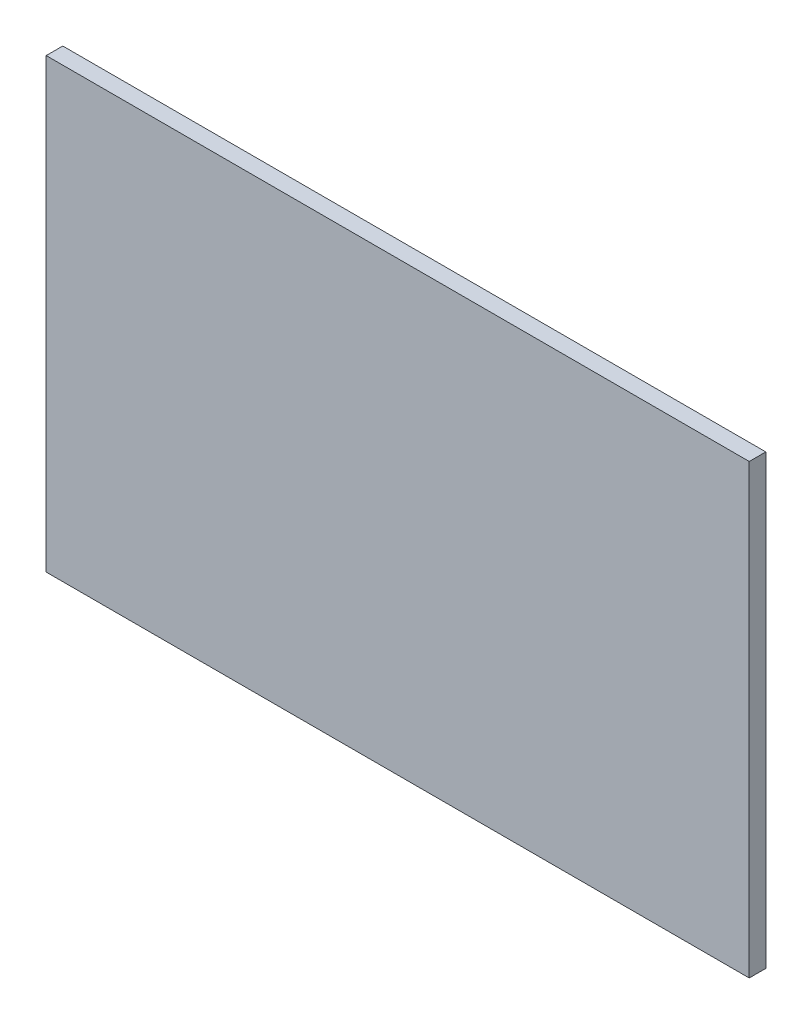
ISO-10303-21;
HEADER;
FILE_DESCRIPTION(('STEP AP214'),'2;1');
FILE_NAME('part.step','',(''),(''),'','','');
FILE_SCHEMA(('AUTOMOTIVE_DESIGN { 1 0 10303 214 1 1 1 1 }'));
ENDSEC;
DATA;
#1=APPLICATION_CONTEXT('core data for automotive mechanical design processes');
#2=APPLICATION_PROTOCOL_DEFINITION('international standard','automotive_design',2000,#1);
#3=PRODUCT_CONTEXT('',#1,'mechanical');
#4=PRODUCT('Part','Part','',(#3));
#5=PRODUCT_RELATED_PRODUCT_CATEGORY('part','',(#4));
#6=PRODUCT_DEFINITION_FORMATION('','',#4);
#7=PRODUCT_DEFINITION_CONTEXT('part definition',#1,'design');
#8=PRODUCT_DEFINITION('design','',#6,#7);
#9=PRODUCT_DEFINITION_SHAPE('','',#8);
#10=(LENGTH_UNIT() NAMED_UNIT(*) SI_UNIT(.MILLI.,.METRE.));
#11=(NAMED_UNIT(*) PLANE_ANGLE_UNIT() SI_UNIT($,.RADIAN.));
#12=(NAMED_UNIT(*) SI_UNIT($,.STERADIAN.) SOLID_ANGLE_UNIT());
#13=UNCERTAINTY_MEASURE_WITH_UNIT(LENGTH_MEASURE(1.E-05),#10,'distance_accuracy_value','');
#14=(GEOMETRIC_REPRESENTATION_CONTEXT(3) GLOBAL_UNCERTAINTY_ASSIGNED_CONTEXT((#13)) GLOBAL_UNIT_ASSIGNED_CONTEXT((#10,
#11,#12)) REPRESENTATION_CONTEXT('',''));
#15=CARTESIAN_POINT('',(0.,0.,0.));
#16=DIRECTION('',(0.,0.,1.));
#17=DIRECTION('',(1.,0.,0.));
#18=AXIS2_PLACEMENT_3D('',#15,#16,#17);
#19=CARTESIAN_POINT('',(0.,0.,1.5));
#20=DIRECTION('',(1.,0.,0.));
#21=DIRECTION('',(0.,0.,-1.));
#22=AXIS2_PLACEMENT_3D('',#19,#20,#21);
#23=PLANE('',#22);
#24=DIRECTION('',(0.,-1.,0.));
#25=VECTOR('',#24,1.);
#26=CARTESIAN_POINT('',(0.,0.,0.));
#27=LINE('',#26,#25);
#28=CARTESIAN_POINT('',(0.,40.5,0.));
#29=VERTEX_POINT('',#28);
#30=CARTESIAN_POINT('',(0.,0.,0.));
#31=VERTEX_POINT('',#30);
#32=EDGE_CURVE('E99',#29,#31,#27,.T.);
#33=ORIENTED_EDGE('',*,*,#32,.T.);
#34=DIRECTION('',(0.,0.,-1.));
#35=VECTOR('',#34,1.);
#36=CARTESIAN_POINT('',(0.,0.,1.5));
#37=LINE('',#36,#35);
#38=CARTESIAN_POINT('',(0.,0.,1.5));
#39=VERTEX_POINT('',#38);
#40=EDGE_CURVE('E11',#39,#31,#37,.T.);
#41=ORIENTED_EDGE('',*,*,#40,.F.);
#42=DIRECTION('',(0.,-1.,0.));
#43=VECTOR('',#42,1.);
#44=CARTESIAN_POINT('',(0.,0.,1.5));
#45=LINE('',#44,#43);
#46=CARTESIAN_POINT('',(0.,40.5,1.5));
#47=VERTEX_POINT('',#46);
#48=EDGE_CURVE('E87',#47,#39,#45,.T.);
#49=ORIENTED_EDGE('',*,*,#48,.F.);
#50=DIRECTION('',(0.,0.,-1.));
#51=VECTOR('',#50,1.);
#52=CARTESIAN_POINT('',(0.,40.5,1.5));
#53=LINE('',#52,#51);
#54=EDGE_CURVE('E95',#47,#29,#53,.T.);
#55=ORIENTED_EDGE('',*,*,#54,.T.);
#56=EDGE_LOOP('',(#33,#41,#49,#55));
#57=FACE_BOUND('',#56,.T.);
#58=ADVANCED_FACE('F36',(#57),#23,.F.);
#59=CARTESIAN_POINT('',(0.,0.,1.5));
#60=DIRECTION('',(0.,1.,0.));
#61=DIRECTION('',(0.,0.,1.));
#62=AXIS2_PLACEMENT_3D('',#59,#60,#61);
#63=PLANE('',#62);
#64=DIRECTION('',(1.,0.,0.));
#65=VECTOR('',#64,1.);
#66=CARTESIAN_POINT('',(0.,0.,0.));
#67=LINE('',#66,#65);
#68=CARTESIAN_POINT('',(63.65,0.,0.));
#69=VERTEX_POINT('',#68);
#70=EDGE_CURVE('E91',#31,#69,#67,.T.);
#71=ORIENTED_EDGE('',*,*,#70,.T.);
#72=DIRECTION('',(0.,0.,-1.));
#73=VECTOR('',#72,1.);
#74=CARTESIAN_POINT('',(63.65,0.,1.5));
#75=LINE('',#74,#73);
#76=CARTESIAN_POINT('',(63.65,0.,1.5));
#77=VERTEX_POINT('',#76);
#78=EDGE_CURVE('E44',#77,#69,#75,.T.);
#79=ORIENTED_EDGE('',*,*,#78,.F.);
#80=DIRECTION('',(1.,0.,0.));
#81=VECTOR('',#80,1.);
#82=CARTESIAN_POINT('',(0.,0.,1.5));
#83=LINE('',#82,#81);
#84=EDGE_CURVE('E82',#39,#77,#83,.T.);
#85=ORIENTED_EDGE('',*,*,#84,.F.);
#86=ORIENTED_EDGE('',*,*,#40,.T.);
#87=EDGE_LOOP('',(#71,#79,#85,#86));
#88=FACE_BOUND('',#87,.T.);
#89=ADVANCED_FACE('F90',(#88),#63,.F.);
#90=CARTESIAN_POINT('',(63.65,0.,1.5));
#91=DIRECTION('',(-1.,0.,0.));
#92=DIRECTION('',(0.,0.,1.));
#93=AXIS2_PLACEMENT_3D('',#90,#91,#92);
#94=PLANE('',#93);
#95=DIRECTION('',(0.,1.,0.));
#96=VECTOR('',#95,1.);
#97=CARTESIAN_POINT('',(63.65,0.,0.));
#98=LINE('',#97,#96);
#99=CARTESIAN_POINT('',(63.65,40.5,0.));
#100=VERTEX_POINT('',#99);
#101=EDGE_CURVE('E69',#69,#100,#98,.T.);
#102=ORIENTED_EDGE('',*,*,#101,.T.);
#103=DIRECTION('',(0.,0.,-1.));
#104=VECTOR('',#103,1.);
#105=CARTESIAN_POINT('',(63.65,40.5,1.5));
#106=LINE('',#105,#104);
#107=CARTESIAN_POINT('',(63.65,40.5,1.5));
#108=VERTEX_POINT('',#107);
#109=EDGE_CURVE('E92',#108,#100,#106,.T.);
#110=ORIENTED_EDGE('',*,*,#109,.F.);
#111=DIRECTION('',(0.,1.,0.));
#112=VECTOR('',#111,1.);
#113=CARTESIAN_POINT('',(63.65,0.,1.5));
#114=LINE('',#113,#112);
#115=EDGE_CURVE('E85',#77,#108,#114,.T.);
#116=ORIENTED_EDGE('',*,*,#115,.F.);
#117=ORIENTED_EDGE('',*,*,#78,.T.);
#118=EDGE_LOOP('',(#102,#110,#116,#117));
#119=FACE_BOUND('',#118,.T.);
#120=ADVANCED_FACE('F93',(#119),#94,.F.);
#121=CARTESIAN_POINT('',(0.,40.5,1.5));
#122=DIRECTION('',(0.,-1.,0.));
#123=DIRECTION('',(0.,0.,-1.));
#124=AXIS2_PLACEMENT_3D('',#121,#122,#123);
#125=PLANE('',#124);
#126=DIRECTION('',(-1.,0.,0.));
#127=VECTOR('',#126,1.);
#128=CARTESIAN_POINT('',(0.,40.5,0.));
#129=LINE('',#128,#127);
#130=EDGE_CURVE('E75',#100,#29,#129,.T.);
#131=ORIENTED_EDGE('',*,*,#130,.T.);
#132=ORIENTED_EDGE('',*,*,#54,.F.);
#133=DIRECTION('',(-1.,0.,0.));
#134=VECTOR('',#133,1.);
#135=CARTESIAN_POINT('',(0.,40.5,1.5));
#136=LINE('',#135,#134);
#137=EDGE_CURVE('E52',#108,#47,#136,.T.);
#138=ORIENTED_EDGE('',*,*,#137,.F.);
#139=ORIENTED_EDGE('',*,*,#109,.T.);
#140=EDGE_LOOP('',(#131,#132,#138,#139));
#141=FACE_BOUND('',#140,.T.);
#142=ADVANCED_FACE('F106',(#141),#125,.F.);
#143=CARTESIAN_POINT('',(0.,0.,1.5));
#144=DIRECTION('',(0.,0.,-1.));
#145=DIRECTION('',(-1.,0.,0.));
#146=AXIS2_PLACEMENT_3D('',#143,#144,#145);
#147=PLANE('',#146);
#148=ORIENTED_EDGE('',*,*,#48,.T.);
#149=ORIENTED_EDGE('',*,*,#84,.T.);
#150=ORIENTED_EDGE('',*,*,#115,.T.);
#151=ORIENTED_EDGE('',*,*,#137,.T.);
#152=EDGE_LOOP('',(#148,#149,#150,#151));
#153=FACE_BOUND('',#152,.T.);
#154=ADVANCED_FACE('F83',(#153),#147,.F.);
#155=CARTESIAN_POINT('',(0.,0.,0.));
#156=DIRECTION('',(0.,0.,-1.));
#157=DIRECTION('',(-1.,0.,0.));
#158=AXIS2_PLACEMENT_3D('',#155,#156,#157);
#159=PLANE('',#158);
#160=ORIENTED_EDGE('',*,*,#32,.F.);
#161=ORIENTED_EDGE('',*,*,#130,.F.);
#162=ORIENTED_EDGE('',*,*,#101,.F.);
#163=ORIENTED_EDGE('',*,*,#70,.F.);
#164=EDGE_LOOP('',(#160,#161,#162,#163));
#165=FACE_BOUND('',#164,.T.);
#166=ADVANCED_FACE('F109',(#165),#159,.T.);
#167=CLOSED_SHELL('',(#58,#89,#120,#142,#154,#166));
#168=MANIFOLD_SOLID_BREP('B2',#167);
#169=ADVANCED_BREP_SHAPE_REPRESENTATION('',(#18,#168),#14);
#170=SHAPE_DEFINITION_REPRESENTATION(#9,#169);
ENDSEC;
END-ISO-10303-21;
